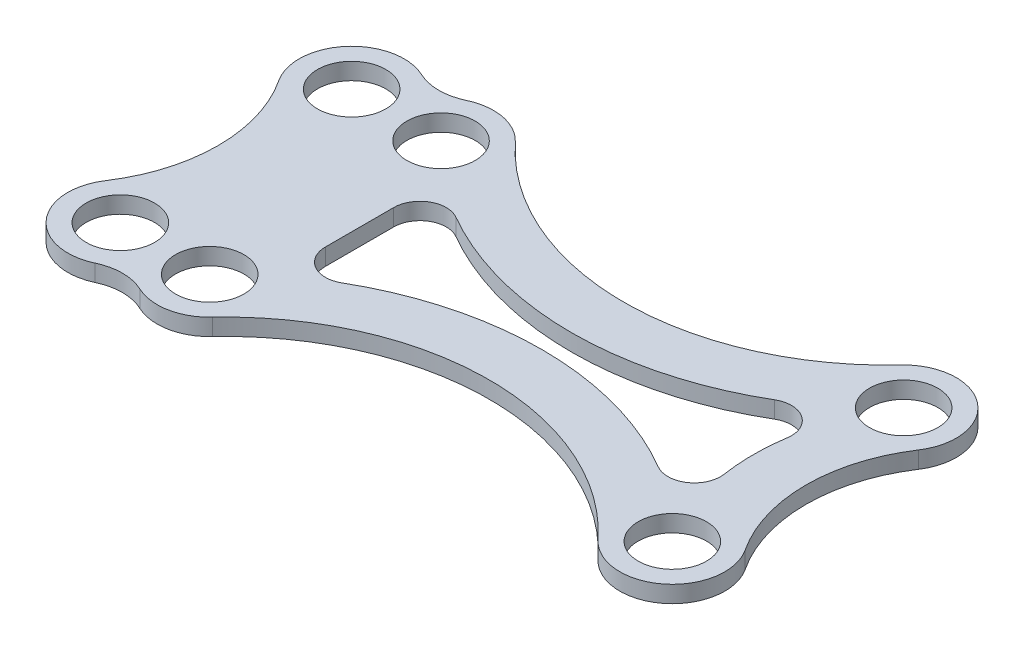
ISO-10303-21;
HEADER;
FILE_DESCRIPTION(('STEP AP214'),'2;1');
FILE_NAME('part.step','',(''),(''),'','','');
FILE_SCHEMA(('AUTOMOTIVE_DESIGN { 1 0 10303 214 1 1 1 1 }'));
ENDSEC;
DATA;
#1=APPLICATION_CONTEXT('core data for automotive mechanical design processes');
#2=APPLICATION_PROTOCOL_DEFINITION('international standard','automotive_design',2000,#1);
#3=PRODUCT_CONTEXT('',#1,'mechanical');
#4=PRODUCT('Part','Part','',(#3));
#5=PRODUCT_RELATED_PRODUCT_CATEGORY('part','',(#4));
#6=PRODUCT_DEFINITION_FORMATION('','',#4);
#7=PRODUCT_DEFINITION_CONTEXT('part definition',#1,'design');
#8=PRODUCT_DEFINITION('design','',#6,#7);
#9=PRODUCT_DEFINITION_SHAPE('','',#8);
#10=(LENGTH_UNIT() NAMED_UNIT(*) SI_UNIT(.MILLI.,.METRE.));
#11=(NAMED_UNIT(*) PLANE_ANGLE_UNIT() SI_UNIT($,.RADIAN.));
#12=(NAMED_UNIT(*) SI_UNIT($,.STERADIAN.) SOLID_ANGLE_UNIT());
#13=UNCERTAINTY_MEASURE_WITH_UNIT(LENGTH_MEASURE(1.E-05),#10,'distance_accuracy_value','');
#14=(GEOMETRIC_REPRESENTATION_CONTEXT(3) GLOBAL_UNCERTAINTY_ASSIGNED_CONTEXT((#13)) GLOBAL_UNIT_ASSIGNED_CONTEXT((#10,
#11,#12)) REPRESENTATION_CONTEXT('',''));
#15=CARTESIAN_POINT('',(0.,0.,0.));
#16=DIRECTION('',(0.,0.,1.));
#17=DIRECTION('',(1.,0.,0.));
#18=AXIS2_PLACEMENT_3D('',#15,#16,#17);
#19=CARTESIAN_POINT('',(-33.4065861769801,-3.2,0.));
#20=DIRECTION('',(0.,1.,0.));
#21=DIRECTION('',(0.,0.,1.));
#22=AXIS2_PLACEMENT_3D('',#19,#20,#21);
#23=CYLINDRICAL_SURFACE('',#22,30.);
#24=CARTESIAN_POINT('',(-33.4065861769801,0.,0.));
#25=DIRECTION('',(0.,-1.,0.));
#26=DIRECTION('',(0.,0.,-1.));
#27=AXIS2_PLACEMENT_3D('',#24,#25,#26);
#28=CIRCLE('',#27,30.);
#29=CARTESIAN_POINT('',(-8.35164654424504,0.,-16.5));
#30=VERTEX_POINT('',#29);
#31=CARTESIAN_POINT('',(-8.35164654424504,0.,16.5));
#32=VERTEX_POINT('',#31);
#33=EDGE_CURVE('E271',#30,#32,#28,.T.);
#34=ORIENTED_EDGE('',*,*,#33,.F.);
#35=DIRECTION('',(0.,1.,0.));
#36=VECTOR('',#35,1.);
#37=CARTESIAN_POINT('',(-8.35164654424504,-3.2,-16.5));
#38=LINE('',#37,#36);
#39=CARTESIAN_POINT('',(-8.35164654424504,-3.2,-16.5));
#40=VERTEX_POINT('',#39);
#41=EDGE_CURVE('E11',#40,#30,#38,.T.);
#42=ORIENTED_EDGE('',*,*,#41,.F.);
#43=CARTESIAN_POINT('',(-33.4065861769801,-3.2,0.));
#44=DIRECTION('',(0.,-1.,0.));
#45=DIRECTION('',(0.,0.,-1.));
#46=AXIS2_PLACEMENT_3D('',#43,#44,#45);
#47=CIRCLE('',#46,30.);
#48=CARTESIAN_POINT('',(-8.35164654424504,-3.2,16.5));
#49=VERTEX_POINT('',#48);
#50=EDGE_CURVE('E307',#40,#49,#47,.T.);
#51=ORIENTED_EDGE('',*,*,#50,.T.);
#52=DIRECTION('',(0.,1.,0.));
#53=VECTOR('',#52,1.);
#54=CARTESIAN_POINT('',(-8.35164654424504,-3.2,16.5));
#55=LINE('',#54,#53);
#56=EDGE_CURVE('E32',#49,#32,#55,.T.);
#57=ORIENTED_EDGE('',*,*,#56,.T.);
#58=EDGE_LOOP('',(#34,#42,#51,#57));
#59=FACE_BOUND('',#58,.T.);
#60=ADVANCED_FACE('F29',(#59),#23,.F.);
#61=CARTESIAN_POINT('',(0.,-3.2,-22.));
#62=DIRECTION('',(0.,1.,0.));
#63=DIRECTION('',(0.,0.,1.));
#64=AXIS2_PLACEMENT_3D('',#61,#62,#63);
#65=CYLINDRICAL_SURFACE('',#64,10.);
#66=CARTESIAN_POINT('',(0.,0.,-22.));
#67=DIRECTION('',(0.,1.,0.));
#68=DIRECTION('',(0.,0.,1.));
#69=AXIS2_PLACEMENT_3D('',#66,#67,#68);
#70=CIRCLE('',#69,10.);
#71=CARTESIAN_POINT('',(4.25,0.,-31.0519334951158));
#72=VERTEX_POINT('',#71);
#73=EDGE_CURVE('E304',#72,#30,#70,.T.);
#74=ORIENTED_EDGE('',*,*,#73,.F.);
#75=DIRECTION('',(0.,1.,0.));
#76=VECTOR('',#75,1.);
#77=CARTESIAN_POINT('',(4.25,-3.2,-31.0519334951158));
#78=LINE('',#77,#76);
#79=CARTESIAN_POINT('',(4.25,-3.2,-31.0519334951158));
#80=VERTEX_POINT('',#79);
#81=EDGE_CURVE('E37',#80,#72,#78,.T.);
#82=ORIENTED_EDGE('',*,*,#81,.F.);
#83=CARTESIAN_POINT('',(0.,-3.2,-22.));
#84=DIRECTION('',(0.,1.,0.));
#85=DIRECTION('',(0.,0.,1.));
#86=AXIS2_PLACEMENT_3D('',#83,#84,#85);
#87=CIRCLE('',#86,10.);
#88=EDGE_CURVE('E340',#80,#40,#87,.T.);
#89=ORIENTED_EDGE('',*,*,#88,.T.);
#90=ORIENTED_EDGE('',*,*,#41,.T.);
#91=EDGE_LOOP('',(#74,#82,#89,#90));
#92=FACE_BOUND('',#91,.T.);
#93=ADVANCED_FACE('F372',(#92),#65,.T.);
#94=CARTESIAN_POINT('',(8.5,-3.2,-40.1038669902317));
#95=DIRECTION('',(0.,1.,0.));
#96=DIRECTION('',(0.,0.,1.));
#97=AXIS2_PLACEMENT_3D('',#94,#95,#96);
#98=CYLINDRICAL_SURFACE('',#97,10.);
#99=CARTESIAN_POINT('',(8.5,0.,-40.1038669902317));
#100=DIRECTION('',(0.,-1.,0.));
#101=DIRECTION('',(0.,0.,1.));
#102=AXIS2_PLACEMENT_3D('',#99,#100,#101);
#103=CIRCLE('',#102,10.);
#104=CARTESIAN_POINT('',(12.75,0.,-31.0519334951158));
#105=VERTEX_POINT('',#104);
#106=EDGE_CURVE('E301',#105,#72,#103,.T.);
#107=ORIENTED_EDGE('',*,*,#106,.F.);
#108=DIRECTION('',(0.,1.,0.));
#109=VECTOR('',#108,1.);
#110=CARTESIAN_POINT('',(12.75,-3.2,-31.0519334951158));
#111=LINE('',#110,#109);
#112=CARTESIAN_POINT('',(12.75,-3.2,-31.0519334951158));
#113=VERTEX_POINT('',#112);
#114=EDGE_CURVE('E344',#113,#105,#111,.T.);
#115=ORIENTED_EDGE('',*,*,#114,.F.);
#116=CARTESIAN_POINT('',(8.5,-3.2,-40.1038669902317));
#117=DIRECTION('',(0.,-1.,0.));
#118=DIRECTION('',(0.,0.,1.));
#119=AXIS2_PLACEMENT_3D('',#116,#117,#118);
#120=CIRCLE('',#119,10.);
#121=EDGE_CURVE('E337',#113,#80,#120,.T.);
#122=ORIENTED_EDGE('',*,*,#121,.T.);
#123=ORIENTED_EDGE('',*,*,#81,.T.);
#124=EDGE_LOOP('',(#107,#115,#122,#123));
#125=FACE_BOUND('',#124,.T.);
#126=ADVANCED_FACE('F409',(#125),#98,.F.);
#127=CARTESIAN_POINT('',(17.,-3.2,-22.));
#128=DIRECTION('',(0.,1.,0.));
#129=DIRECTION('',(0.,0.,1.));
#130=AXIS2_PLACEMENT_3D('',#127,#128,#129);
#131=CYLINDRICAL_SURFACE('',#130,9.99999999999999);
#132=CARTESIAN_POINT('',(17.,0.,-22.));
#133=DIRECTION('',(0.,1.,0.));
#134=DIRECTION('',(0.,0.,1.));
#135=AXIS2_PLACEMENT_3D('',#132,#133,#134);
#136=CIRCLE('',#135,9.99999999999999);
#137=CARTESIAN_POINT('',(24.3333333333333,0.,-28.7986926847904));
#138=VERTEX_POINT('',#137);
#139=EDGE_CURVE('E298',#138,#105,#136,.T.);
#140=ORIENTED_EDGE('',*,*,#139,.F.);
#141=DIRECTION('',(0.,1.,0.));
#142=VECTOR('',#141,1.);
#143=CARTESIAN_POINT('',(24.3333333333333,-3.2,-28.7986926847904));
#144=LINE('',#143,#142);
#145=CARTESIAN_POINT('',(24.3333333333333,-3.2,-28.7986926847904));
#146=VERTEX_POINT('',#145);
#147=EDGE_CURVE('E346',#146,#138,#144,.T.);
#148=ORIENTED_EDGE('',*,*,#147,.F.);
#149=CARTESIAN_POINT('',(17.,-3.2,-22.));
#150=DIRECTION('',(0.,1.,0.));
#151=DIRECTION('',(0.,0.,1.));
#152=AXIS2_PLACEMENT_3D('',#149,#150,#151);
#153=CIRCLE('',#152,9.99999999999999);
#154=EDGE_CURVE('E334',#146,#113,#153,.T.);
#155=ORIENTED_EDGE('',*,*,#154,.T.);
#156=ORIENTED_EDGE('',*,*,#114,.T.);
#157=EDGE_LOOP('',(#140,#148,#155,#156));
#158=FACE_BOUND('',#157,.T.);
#159=ADVANCED_FACE('F406',(#158),#131,.T.);
#160=CARTESIAN_POINT('',(61.,-3.2,-62.7921561087423));
#161=DIRECTION('',(0.,1.,0.));
#162=DIRECTION('',(0.,0.,1.));
#163=AXIS2_PLACEMENT_3D('',#160,#161,#162);
#164=CYLINDRICAL_SURFACE('',#163,50.);
#165=CARTESIAN_POINT('',(61.,0.,-62.7921561087423));
#166=DIRECTION('',(0.,-1.,0.));
#167=DIRECTION('',(0.,0.,1.));
#168=AXIS2_PLACEMENT_3D('',#165,#166,#167);
#169=CIRCLE('',#168,50.);
#170=CARTESIAN_POINT('',(97.6666666666667,0.,-28.7986926847904));
#171=VERTEX_POINT('',#170);
#172=EDGE_CURVE('E295',#171,#138,#169,.T.);
#173=ORIENTED_EDGE('',*,*,#172,.F.);
#174=DIRECTION('',(0.,1.,0.));
#175=VECTOR('',#174,1.);
#176=CARTESIAN_POINT('',(97.6666666666667,-3.2,-28.7986926847904));
#177=LINE('',#176,#175);
#178=CARTESIAN_POINT('',(97.6666666666667,-3.2,-28.7986926847904));
#179=VERTEX_POINT('',#178);
#180=EDGE_CURVE('E348',#179,#171,#177,.T.);
#181=ORIENTED_EDGE('',*,*,#180,.F.);
#182=CARTESIAN_POINT('',(61.,-3.2,-62.7921561087423));
#183=DIRECTION('',(0.,-1.,0.));
#184=DIRECTION('',(0.,0.,1.));
#185=AXIS2_PLACEMENT_3D('',#182,#183,#184);
#186=CIRCLE('',#185,50.);
#187=EDGE_CURVE('E331',#179,#146,#186,.T.);
#188=ORIENTED_EDGE('',*,*,#187,.T.);
#189=ORIENTED_EDGE('',*,*,#147,.T.);
#190=EDGE_LOOP('',(#173,#181,#188,#189));
#191=FACE_BOUND('',#190,.T.);
#192=ADVANCED_FACE('F403',(#191),#164,.F.);
#193=CARTESIAN_POINT('',(105.,-3.2,-22.));
#194=DIRECTION('',(0.,1.,0.));
#195=DIRECTION('',(0.,0.,1.));
#196=AXIS2_PLACEMENT_3D('',#193,#194,#195);
#197=CYLINDRICAL_SURFACE('',#196,10.);
#198=CARTESIAN_POINT('',(105.,0.,-22.));
#199=DIRECTION('',(0.,1.,0.));
#200=DIRECTION('',(0.,0.,1.));
#201=AXIS2_PLACEMENT_3D('',#198,#199,#200);
#202=CIRCLE('',#201,10.);
#203=CARTESIAN_POINT('',(113.351646544245,0.,-16.5));
#204=VERTEX_POINT('',#203);
#205=EDGE_CURVE('E292',#204,#171,#202,.T.);
#206=ORIENTED_EDGE('',*,*,#205,.F.);
#207=DIRECTION('',(0.,1.,0.));
#208=VECTOR('',#207,1.);
#209=CARTESIAN_POINT('',(113.351646544245,-3.2,-16.5));
#210=LINE('',#209,#208);
#211=CARTESIAN_POINT('',(113.351646544245,-3.2,-16.5));
#212=VERTEX_POINT('',#211);
#213=EDGE_CURVE('E350',#212,#204,#210,.T.);
#214=ORIENTED_EDGE('',*,*,#213,.F.);
#215=CARTESIAN_POINT('',(105.,-3.2,-22.));
#216=DIRECTION('',(0.,1.,0.));
#217=DIRECTION('',(0.,0.,1.));
#218=AXIS2_PLACEMENT_3D('',#215,#216,#217);
#219=CIRCLE('',#218,10.);
#220=EDGE_CURVE('E328',#212,#179,#219,.T.);
#221=ORIENTED_EDGE('',*,*,#220,.T.);
#222=ORIENTED_EDGE('',*,*,#180,.T.);
#223=EDGE_LOOP('',(#206,#214,#221,#222));
#224=FACE_BOUND('',#223,.T.);
#225=ADVANCED_FACE('F399',(#224),#197,.T.);
#226=CARTESIAN_POINT('',(138.40658617698,-3.2,0.));
#227=DIRECTION('',(0.,1.,0.));
#228=DIRECTION('',(0.,0.,1.));
#229=AXIS2_PLACEMENT_3D('',#226,#227,#228);
#230=CYLINDRICAL_SURFACE('',#229,30.);
#231=CARTESIAN_POINT('',(138.40658617698,0.,0.));
#232=DIRECTION('',(0.,-1.,0.));
#233=DIRECTION('',(0.,0.,1.));
#234=AXIS2_PLACEMENT_3D('',#231,#232,#233);
#235=CIRCLE('',#234,30.);
#236=CARTESIAN_POINT('',(113.351646544245,0.,16.5));
#237=VERTEX_POINT('',#236);
#238=EDGE_CURVE('E289',#237,#204,#235,.T.);
#239=ORIENTED_EDGE('',*,*,#238,.F.);
#240=DIRECTION('',(0.,1.,0.));
#241=VECTOR('',#240,1.);
#242=CARTESIAN_POINT('',(113.351646544245,-3.2,16.5));
#243=LINE('',#242,#241);
#244=CARTESIAN_POINT('',(113.351646544245,-3.2,16.5));
#245=VERTEX_POINT('',#244);
#246=EDGE_CURVE('E352',#245,#237,#243,.T.);
#247=ORIENTED_EDGE('',*,*,#246,.F.);
#248=CARTESIAN_POINT('',(138.40658617698,-3.2,0.));
#249=DIRECTION('',(0.,-1.,0.));
#250=DIRECTION('',(0.,0.,1.));
#251=AXIS2_PLACEMENT_3D('',#248,#249,#250);
#252=CIRCLE('',#251,30.);
#253=EDGE_CURVE('E325',#245,#212,#252,.T.);
#254=ORIENTED_EDGE('',*,*,#253,.T.);
#255=ORIENTED_EDGE('',*,*,#213,.T.);
#256=EDGE_LOOP('',(#239,#247,#254,#255));
#257=FACE_BOUND('',#256,.T.);
#258=ADVANCED_FACE('F395',(#257),#230,.F.);
#259=CARTESIAN_POINT('',(105.,-3.2,22.));
#260=DIRECTION('',(0.,1.,0.));
#261=DIRECTION('',(0.,0.,1.));
#262=AXIS2_PLACEMENT_3D('',#259,#260,#261);
#263=CYLINDRICAL_SURFACE('',#262,10.);
#264=CARTESIAN_POINT('',(105.,0.,22.));
#265=DIRECTION('',(0.,1.,0.));
#266=DIRECTION('',(0.,0.,-1.));
#267=AXIS2_PLACEMENT_3D('',#264,#265,#266);
#268=CIRCLE('',#267,10.);
#269=CARTESIAN_POINT('',(97.6666666666667,0.,28.7986926847904));
#270=VERTEX_POINT('',#269);
#271=EDGE_CURVE('E286',#270,#237,#268,.T.);
#272=ORIENTED_EDGE('',*,*,#271,.F.);
#273=DIRECTION('',(0.,1.,0.));
#274=VECTOR('',#273,1.);
#275=CARTESIAN_POINT('',(97.6666666666667,-3.2,28.7986926847904));
#276=LINE('',#275,#274);
#277=CARTESIAN_POINT('',(97.6666666666667,-3.2,28.7986926847904));
#278=VERTEX_POINT('',#277);
#279=EDGE_CURVE('E354',#278,#270,#276,.T.);
#280=ORIENTED_EDGE('',*,*,#279,.F.);
#281=CARTESIAN_POINT('',(105.,-3.2,22.));
#282=DIRECTION('',(0.,1.,0.));
#283=DIRECTION('',(0.,0.,-1.));
#284=AXIS2_PLACEMENT_3D('',#281,#282,#283);
#285=CIRCLE('',#284,10.);
#286=EDGE_CURVE('E322',#278,#245,#285,.T.);
#287=ORIENTED_EDGE('',*,*,#286,.T.);
#288=ORIENTED_EDGE('',*,*,#246,.T.);
#289=EDGE_LOOP('',(#272,#280,#287,#288));
#290=FACE_BOUND('',#289,.T.);
#291=ADVANCED_FACE('F391',(#290),#263,.T.);
#292=CARTESIAN_POINT('',(61.,-3.2,62.7921561087423));
#293=DIRECTION('',(0.,1.,0.));
#294=DIRECTION('',(0.,0.,1.));
#295=AXIS2_PLACEMENT_3D('',#292,#293,#294);
#296=CYLINDRICAL_SURFACE('',#295,50.);
#297=CARTESIAN_POINT('',(61.,0.,62.7921561087423));
#298=DIRECTION('',(0.,-1.,0.));
#299=DIRECTION('',(0.,0.,-1.));
#300=AXIS2_PLACEMENT_3D('',#297,#298,#299);
#301=CIRCLE('',#300,50.);
#302=CARTESIAN_POINT('',(24.3333333333333,0.,28.7986926847903));
#303=VERTEX_POINT('',#302);
#304=EDGE_CURVE('E283',#303,#270,#301,.T.);
#305=ORIENTED_EDGE('',*,*,#304,.F.);
#306=DIRECTION('',(0.,1.,0.));
#307=VECTOR('',#306,1.);
#308=CARTESIAN_POINT('',(24.3333333333333,-3.2,28.7986926847903));
#309=LINE('',#308,#307);
#310=CARTESIAN_POINT('',(24.3333333333333,-3.2,28.7986926847903));
#311=VERTEX_POINT('',#310);
#312=EDGE_CURVE('E356',#311,#303,#309,.T.);
#313=ORIENTED_EDGE('',*,*,#312,.F.);
#314=CARTESIAN_POINT('',(61.,-3.2,62.7921561087423));
#315=DIRECTION('',(0.,-1.,0.));
#316=DIRECTION('',(0.,0.,-1.));
#317=AXIS2_PLACEMENT_3D('',#314,#315,#316);
#318=CIRCLE('',#317,50.);
#319=EDGE_CURVE('E319',#311,#278,#318,.T.);
#320=ORIENTED_EDGE('',*,*,#319,.T.);
#321=ORIENTED_EDGE('',*,*,#279,.T.);
#322=EDGE_LOOP('',(#305,#313,#320,#321));
#323=FACE_BOUND('',#322,.T.);
#324=ADVANCED_FACE('F387',(#323),#296,.F.);
#325=CARTESIAN_POINT('',(17.,-3.2,22.));
#326=DIRECTION('',(0.,1.,0.));
#327=DIRECTION('',(0.,0.,1.));
#328=AXIS2_PLACEMENT_3D('',#325,#326,#327);
#329=CYLINDRICAL_SURFACE('',#328,9.99999999999999);
#330=CARTESIAN_POINT('',(17.,0.,22.));
#331=DIRECTION('',(0.,1.,0.));
#332=DIRECTION('',(0.,0.,-1.));
#333=AXIS2_PLACEMENT_3D('',#330,#331,#332);
#334=CIRCLE('',#333,9.99999999999999);
#335=CARTESIAN_POINT('',(12.75,0.,31.0519334951158));
#336=VERTEX_POINT('',#335);
#337=EDGE_CURVE('E280',#336,#303,#334,.T.);
#338=ORIENTED_EDGE('',*,*,#337,.F.);
#339=DIRECTION('',(0.,1.,0.));
#340=VECTOR('',#339,1.);
#341=CARTESIAN_POINT('',(12.75,-3.2,31.0519334951158));
#342=LINE('',#341,#340);
#343=CARTESIAN_POINT('',(12.75,-3.2,31.0519334951158));
#344=VERTEX_POINT('',#343);
#345=EDGE_CURVE('E358',#344,#336,#342,.T.);
#346=ORIENTED_EDGE('',*,*,#345,.F.);
#347=CARTESIAN_POINT('',(17.,-3.2,22.));
#348=DIRECTION('',(0.,1.,0.));
#349=DIRECTION('',(0.,0.,-1.));
#350=AXIS2_PLACEMENT_3D('',#347,#348,#349);
#351=CIRCLE('',#350,9.99999999999999);
#352=EDGE_CURVE('E316',#344,#311,#351,.T.);
#353=ORIENTED_EDGE('',*,*,#352,.T.);
#354=ORIENTED_EDGE('',*,*,#312,.T.);
#355=EDGE_LOOP('',(#338,#346,#353,#354));
#356=FACE_BOUND('',#355,.T.);
#357=ADVANCED_FACE('F385',(#356),#329,.T.);
#358=CARTESIAN_POINT('',(8.5,-3.2,40.1038669902317));
#359=DIRECTION('',(0.,1.,0.));
#360=DIRECTION('',(0.,0.,1.));
#361=AXIS2_PLACEMENT_3D('',#358,#359,#360);
#362=CYLINDRICAL_SURFACE('',#361,10.);
#363=CARTESIAN_POINT('',(8.5,0.,40.1038669902317));
#364=DIRECTION('',(0.,-1.,0.));
#365=DIRECTION('',(0.,0.,-1.));
#366=AXIS2_PLACEMENT_3D('',#363,#364,#365);
#367=CIRCLE('',#366,10.);
#368=CARTESIAN_POINT('',(4.24999999999999,0.,31.0519334951158));
#369=VERTEX_POINT('',#368);
#370=EDGE_CURVE('E277',#369,#336,#367,.T.);
#371=ORIENTED_EDGE('',*,*,#370,.F.);
#372=DIRECTION('',(0.,1.,0.));
#373=VECTOR('',#372,1.);
#374=CARTESIAN_POINT('',(4.24999999999999,-3.2,31.0519334951158));
#375=LINE('',#374,#373);
#376=CARTESIAN_POINT('',(4.24999999999999,-3.2,31.0519334951158));
#377=VERTEX_POINT('',#376);
#378=EDGE_CURVE('E359',#377,#369,#375,.T.);
#379=ORIENTED_EDGE('',*,*,#378,.F.);
#380=CARTESIAN_POINT('',(8.5,-3.2,40.1038669902317));
#381=DIRECTION('',(0.,-1.,0.));
#382=DIRECTION('',(0.,0.,-1.));
#383=AXIS2_PLACEMENT_3D('',#380,#381,#382);
#384=CIRCLE('',#383,10.);
#385=EDGE_CURVE('E313',#377,#344,#384,.T.);
#386=ORIENTED_EDGE('',*,*,#385,.T.);
#387=ORIENTED_EDGE('',*,*,#345,.T.);
#388=EDGE_LOOP('',(#371,#379,#386,#387));
#389=FACE_BOUND('',#388,.T.);
#390=ADVANCED_FACE('F381',(#389),#362,.F.);
#391=CARTESIAN_POINT('',(0.,-3.2,22.));
#392=DIRECTION('',(0.,1.,0.));
#393=DIRECTION('',(0.,0.,1.));
#394=AXIS2_PLACEMENT_3D('',#391,#392,#393);
#395=CYLINDRICAL_SURFACE('',#394,10.);
#396=CARTESIAN_POINT('',(0.,0.,22.));
#397=DIRECTION('',(0.,1.,0.));
#398=DIRECTION('',(0.,0.,-1.));
#399=AXIS2_PLACEMENT_3D('',#396,#397,#398);
#400=CIRCLE('',#399,10.);
#401=EDGE_CURVE('E274',#32,#369,#400,.T.);
#402=ORIENTED_EDGE('',*,*,#401,.F.);
#403=ORIENTED_EDGE('',*,*,#56,.F.);
#404=CARTESIAN_POINT('',(0.,-3.2,22.));
#405=DIRECTION('',(0.,1.,0.));
#406=DIRECTION('',(0.,0.,-1.));
#407=AXIS2_PLACEMENT_3D('',#404,#405,#406);
#408=CIRCLE('',#407,10.);
#409=EDGE_CURVE('E310',#49,#377,#408,.T.);
#410=ORIENTED_EDGE('',*,*,#409,.T.);
#411=ORIENTED_EDGE('',*,*,#378,.T.);
#412=EDGE_LOOP('',(#402,#403,#410,#411));
#413=FACE_BOUND('',#412,.T.);
#414=ADVANCED_FACE('F367',(#413),#395,.T.);
#415=CARTESIAN_POINT('',(-16.7032930884901,-3.2,11.));
#416=DIRECTION('',(0.,-1.,0.));
#417=DIRECTION('',(0.,0.,-1.));
#418=AXIS2_PLACEMENT_3D('',#415,#416,#417);
#419=PLANE('',#418);
#420=CARTESIAN_POINT('',(61.,-3.2,62.7921561087423));
#421=DIRECTION('',(0.,-1.,0.));
#422=DIRECTION('',(0.,0.,1.));
#423=AXIS2_PLACEMENT_3D('',#420,#421,#422);
#424=CIRCLE('',#423,60.);
#425=CARTESIAN_POINT('',(31.,-3.2,10.8306318816759));
#426=VERTEX_POINT('',#425);
#427=CARTESIAN_POINT('',(91.3825972699008,-3.2,11.053410635596));
#428=VERTEX_POINT('',#427);
#429=EDGE_CURVE('E202',#426,#428,#424,.T.);
#430=ORIENTED_EDGE('',*,*,#429,.T.);
#431=CARTESIAN_POINT('',(93.9144803757259,-3.2,6.74184851283382));
#432=DIRECTION('',(0.,1.,0.));
#433=DIRECTION('',(0.,0.,1.));
#434=AXIS2_PLACEMENT_3D('',#431,#432,#433);
#435=CIRCLE('',#434,5.);
#436=CARTESIAN_POINT('',(98.8580476869764,-3.2,5.99275423363006));
#437=VERTEX_POINT('',#436);
#438=EDGE_CURVE('E205',#428,#437,#435,.T.);
#439=ORIENTED_EDGE('',*,*,#438,.T.);
#440=CARTESIAN_POINT('',(138.40658617698,-3.2,0.));
#441=DIRECTION('',(0.,-1.,0.));
#442=DIRECTION('',(0.,0.,1.));
#443=AXIS2_PLACEMENT_3D('',#440,#441,#442);
#444=CIRCLE('',#443,40.);
#445=CARTESIAN_POINT('',(98.8580476869764,-3.2,-5.99275423363008));
#446=VERTEX_POINT('',#445);
#447=EDGE_CURVE('E45',#437,#446,#444,.T.);
#448=ORIENTED_EDGE('',*,*,#447,.T.);
#449=CARTESIAN_POINT('',(93.9144803757259,-3.2,-6.74184851283382));
#450=DIRECTION('',(0.,1.,0.));
#451=DIRECTION('',(0.,0.,-1.));
#452=AXIS2_PLACEMENT_3D('',#449,#450,#451);
#453=CIRCLE('',#452,5.);
#454=CARTESIAN_POINT('',(91.3825972699008,-3.2,-11.053410635596));
#455=VERTEX_POINT('',#454);
#456=EDGE_CURVE('E208',#446,#455,#453,.T.);
#457=ORIENTED_EDGE('',*,*,#456,.T.);
#458=CARTESIAN_POINT('',(61.,-3.2,-62.7921561087423));
#459=DIRECTION('',(0.,-1.,0.));
#460=DIRECTION('',(0.,0.,1.));
#461=AXIS2_PLACEMENT_3D('',#458,#459,#460);
#462=CIRCLE('',#461,60.);
#463=CARTESIAN_POINT('',(31.,-3.2,-10.830631881676));
#464=VERTEX_POINT('',#463);
#465=EDGE_CURVE('E211',#455,#464,#462,.T.);
#466=ORIENTED_EDGE('',*,*,#465,.T.);
#467=CARTESIAN_POINT('',(28.5,-3.2,-6.50050486275375));
#468=DIRECTION('',(0.,1.,0.));
#469=DIRECTION('',(0.,0.,1.));
#470=AXIS2_PLACEMENT_3D('',#467,#468,#469);
#471=CIRCLE('',#470,5.);
#472=CARTESIAN_POINT('',(23.5,-3.2,-6.50050486275376));
#473=VERTEX_POINT('',#472);
#474=EDGE_CURVE('E214',#464,#473,#471,.T.);
#475=ORIENTED_EDGE('',*,*,#474,.T.);
#476=DIRECTION('',(0.,0.,1.));
#477=VECTOR('',#476,1.);
#478=CARTESIAN_POINT('',(23.5,-3.2,-6.50050486275375));
#479=LINE('',#478,#477);
#480=CARTESIAN_POINT('',(23.5,-3.2,6.50050486275375));
#481=VERTEX_POINT('',#480);
#482=EDGE_CURVE('E217',#473,#481,#479,.T.);
#483=ORIENTED_EDGE('',*,*,#482,.T.);
#484=CARTESIAN_POINT('',(28.5,-3.2,6.50050486275375));
#485=DIRECTION('',(0.,1.,0.));
#486=DIRECTION('',(0.,0.,1.));
#487=AXIS2_PLACEMENT_3D('',#484,#485,#486);
#488=CIRCLE('',#487,4.99999999999999);
#489=EDGE_CURVE('E220',#481,#426,#488,.T.);
#490=ORIENTED_EDGE('',*,*,#489,.T.);
#491=EDGE_LOOP('',(#430,#439,#448,#457,#466,#475,#483,#490));
#492=FACE_BOUND('',#491,.T.);
#493=CARTESIAN_POINT('',(0.,-3.2,22.));
#494=DIRECTION('',(0.,1.,0.));
#495=DIRECTION('',(0.,0.,1.));
#496=AXIS2_PLACEMENT_3D('',#493,#494,#495);
#497=CIRCLE('',#496,6.5);
#498=CARTESIAN_POINT('',(0.,-3.2,28.5));
#499=VERTEX_POINT('',#498);
#500=EDGE_CURVE('E238',#499,#499,#497,.T.);
#501=ORIENTED_EDGE('',*,*,#500,.T.);
#502=EDGE_LOOP('',(#501));
#503=FACE_BOUND('',#502,.T.);
#504=CARTESIAN_POINT('',(17.,-3.2,22.));
#505=DIRECTION('',(0.,1.,0.));
#506=DIRECTION('',(0.,0.,1.));
#507=AXIS2_PLACEMENT_3D('',#504,#505,#506);
#508=CIRCLE('',#507,6.5);
#509=CARTESIAN_POINT('',(17.,-3.2,28.5));
#510=VERTEX_POINT('',#509);
#511=EDGE_CURVE('E244',#510,#510,#508,.T.);
#512=ORIENTED_EDGE('',*,*,#511,.T.);
#513=EDGE_LOOP('',(#512));
#514=FACE_BOUND('',#513,.T.);
#515=CARTESIAN_POINT('',(105.,-3.2,22.));
#516=DIRECTION('',(0.,1.,0.));
#517=DIRECTION('',(0.,0.,1.));
#518=AXIS2_PLACEMENT_3D('',#515,#516,#517);
#519=CIRCLE('',#518,6.5);
#520=CARTESIAN_POINT('',(105.,-3.2,28.5));
#521=VERTEX_POINT('',#520);
#522=EDGE_CURVE('E250',#521,#521,#519,.T.);
#523=ORIENTED_EDGE('',*,*,#522,.T.);
#524=EDGE_LOOP('',(#523));
#525=FACE_BOUND('',#524,.T.);
#526=CARTESIAN_POINT('',(105.,-3.2,-22.));
#527=DIRECTION('',(0.,1.,0.));
#528=DIRECTION('',(0.,0.,1.));
#529=AXIS2_PLACEMENT_3D('',#526,#527,#528);
#530=CIRCLE('',#529,6.5);
#531=CARTESIAN_POINT('',(105.,-3.2,-15.5));
#532=VERTEX_POINT('',#531);
#533=EDGE_CURVE('E256',#532,#532,#530,.T.);
#534=ORIENTED_EDGE('',*,*,#533,.T.);
#535=EDGE_LOOP('',(#534));
#536=FACE_BOUND('',#535,.T.);
#537=CARTESIAN_POINT('',(17.,-3.2,-22.));
#538=DIRECTION('',(0.,1.,0.));
#539=DIRECTION('',(0.,0.,1.));
#540=AXIS2_PLACEMENT_3D('',#537,#538,#539);
#541=CIRCLE('',#540,6.5);
#542=CARTESIAN_POINT('',(17.,-3.2,-15.5));
#543=VERTEX_POINT('',#542);
#544=EDGE_CURVE('E262',#543,#543,#541,.T.);
#545=ORIENTED_EDGE('',*,*,#544,.T.);
#546=EDGE_LOOP('',(#545));
#547=FACE_BOUND('',#546,.T.);
#548=CARTESIAN_POINT('',(0.,-3.2,-22.));
#549=DIRECTION('',(0.,1.,0.));
#550=DIRECTION('',(0.,0.,1.));
#551=AXIS2_PLACEMENT_3D('',#548,#549,#550);
#552=CIRCLE('',#551,6.5);
#553=CARTESIAN_POINT('',(0.,-3.2,-15.5));
#554=VERTEX_POINT('',#553);
#555=EDGE_CURVE('E268',#554,#554,#552,.T.);
#556=ORIENTED_EDGE('',*,*,#555,.T.);
#557=EDGE_LOOP('',(#556));
#558=FACE_BOUND('',#557,.T.);
#559=ORIENTED_EDGE('',*,*,#50,.F.);
#560=ORIENTED_EDGE('',*,*,#88,.F.);
#561=ORIENTED_EDGE('',*,*,#121,.F.);
#562=ORIENTED_EDGE('',*,*,#154,.F.);
#563=ORIENTED_EDGE('',*,*,#187,.F.);
#564=ORIENTED_EDGE('',*,*,#220,.F.);
#565=ORIENTED_EDGE('',*,*,#253,.F.);
#566=ORIENTED_EDGE('',*,*,#286,.F.);
#567=ORIENTED_EDGE('',*,*,#319,.F.);
#568=ORIENTED_EDGE('',*,*,#352,.F.);
#569=ORIENTED_EDGE('',*,*,#385,.F.);
#570=ORIENTED_EDGE('',*,*,#409,.F.);
#571=EDGE_LOOP('',(#559,#560,#561,#562,#563,#564,#565,#566,#567,#568,#569,#570));
#572=FACE_BOUND('',#571,.T.);
#573=ADVANCED_FACE('F375',(#492,#503,#514,#525,#536,#547,#558,#572),#419,.T.);
#574=CARTESIAN_POINT('',(-16.7032930884901,0.,11.));
#575=DIRECTION('',(0.,-1.,0.));
#576=DIRECTION('',(0.,0.,-1.));
#577=AXIS2_PLACEMENT_3D('',#574,#575,#576);
#578=PLANE('',#577);
#579=CARTESIAN_POINT('',(93.9144803757259,0.,6.74184851283382));
#580=DIRECTION('',(0.,1.,0.));
#581=DIRECTION('',(0.,0.,1.));
#582=AXIS2_PLACEMENT_3D('',#579,#580,#581);
#583=CIRCLE('',#582,5.);
#584=CARTESIAN_POINT('',(91.3825972699008,0.,11.053410635596));
#585=VERTEX_POINT('',#584);
#586=CARTESIAN_POINT('',(98.8580476869764,0.,5.99275423363006));
#587=VERTEX_POINT('',#586);
#588=EDGE_CURVE('E177',#585,#587,#583,.T.);
#589=ORIENTED_EDGE('',*,*,#588,.F.);
#590=CARTESIAN_POINT('',(61.,0.,62.7921561087423));
#591=DIRECTION('',(0.,-1.,0.));
#592=DIRECTION('',(0.,0.,1.));
#593=AXIS2_PLACEMENT_3D('',#590,#591,#592);
#594=CIRCLE('',#593,60.);
#595=CARTESIAN_POINT('',(31.,0.,10.8306318816759));
#596=VERTEX_POINT('',#595);
#597=EDGE_CURVE('E53',#596,#585,#594,.T.);
#598=ORIENTED_EDGE('',*,*,#597,.F.);
#599=CARTESIAN_POINT('',(28.5,0.,6.50050486275375));
#600=DIRECTION('',(0.,1.,0.));
#601=DIRECTION('',(0.,0.,1.));
#602=AXIS2_PLACEMENT_3D('',#599,#600,#601);
#603=CIRCLE('',#602,4.99999999999999);
#604=CARTESIAN_POINT('',(23.5,0.,6.50050486275375));
#605=VERTEX_POINT('',#604);
#606=EDGE_CURVE('E199',#605,#596,#603,.T.);
#607=ORIENTED_EDGE('',*,*,#606,.F.);
#608=DIRECTION('',(0.,0.,1.));
#609=VECTOR('',#608,1.);
#610=CARTESIAN_POINT('',(23.5,0.,-6.50050486275375));
#611=LINE('',#610,#609);
#612=CARTESIAN_POINT('',(23.5,0.,-6.50050486275376));
#613=VERTEX_POINT('',#612);
#614=EDGE_CURVE('E196',#613,#605,#611,.T.);
#615=ORIENTED_EDGE('',*,*,#614,.F.);
#616=CARTESIAN_POINT('',(28.5,0.,-6.50050486275375));
#617=DIRECTION('',(0.,1.,0.));
#618=DIRECTION('',(0.,0.,1.));
#619=AXIS2_PLACEMENT_3D('',#616,#617,#618);
#620=CIRCLE('',#619,5.);
#621=CARTESIAN_POINT('',(31.,0.,-10.830631881676));
#622=VERTEX_POINT('',#621);
#623=EDGE_CURVE('E193',#622,#613,#620,.T.);
#624=ORIENTED_EDGE('',*,*,#623,.F.);
#625=CARTESIAN_POINT('',(61.,0.,-62.7921561087423));
#626=DIRECTION('',(0.,-1.,0.));
#627=DIRECTION('',(0.,0.,1.));
#628=AXIS2_PLACEMENT_3D('',#625,#626,#627);
#629=CIRCLE('',#628,60.);
#630=CARTESIAN_POINT('',(91.3825972699008,0.,-11.053410635596));
#631=VERTEX_POINT('',#630);
#632=EDGE_CURVE('E187',#631,#622,#629,.T.);
#633=ORIENTED_EDGE('',*,*,#632,.F.);
#634=CARTESIAN_POINT('',(93.9144803757259,0.,-6.74184851283382));
#635=DIRECTION('',(0.,1.,0.));
#636=DIRECTION('',(0.,0.,-1.));
#637=AXIS2_PLACEMENT_3D('',#634,#635,#636);
#638=CIRCLE('',#637,5.);
#639=CARTESIAN_POINT('',(98.8580476869764,0.,-5.99275423363008));
#640=VERTEX_POINT('',#639);
#641=EDGE_CURVE('E185',#640,#631,#638,.T.);
#642=ORIENTED_EDGE('',*,*,#641,.F.);
#643=CARTESIAN_POINT('',(138.40658617698,0.,0.));
#644=DIRECTION('',(0.,-1.,0.));
#645=DIRECTION('',(0.,0.,1.));
#646=AXIS2_PLACEMENT_3D('',#643,#644,#645);
#647=CIRCLE('',#646,40.);
#648=EDGE_CURVE('E168',#587,#640,#647,.T.);
#649=ORIENTED_EDGE('',*,*,#648,.F.);
#650=EDGE_LOOP('',(#589,#598,#607,#615,#624,#633,#642,#649));
#651=FACE_BOUND('',#650,.T.);
#652=CARTESIAN_POINT('',(0.,0.,22.));
#653=DIRECTION('',(0.,1.,0.));
#654=DIRECTION('',(0.,0.,1.));
#655=AXIS2_PLACEMENT_3D('',#652,#653,#654);
#656=CIRCLE('',#655,6.5);
#657=CARTESIAN_POINT('',(0.,0.,28.5));
#658=VERTEX_POINT('',#657);
#659=EDGE_CURVE('E225',#658,#658,#656,.T.);
#660=ORIENTED_EDGE('',*,*,#659,.F.);
#661=EDGE_LOOP('',(#660));
#662=FACE_BOUND('',#661,.T.);
#663=CARTESIAN_POINT('',(17.,0.,22.));
#664=DIRECTION('',(0.,1.,0.));
#665=DIRECTION('',(0.,0.,1.));
#666=AXIS2_PLACEMENT_3D('',#663,#664,#665);
#667=CIRCLE('',#666,6.5);
#668=CARTESIAN_POINT('',(17.,0.,28.5));
#669=VERTEX_POINT('',#668);
#670=EDGE_CURVE('E241',#669,#669,#667,.T.);
#671=ORIENTED_EDGE('',*,*,#670,.F.);
#672=EDGE_LOOP('',(#671));
#673=FACE_BOUND('',#672,.T.);
#674=CARTESIAN_POINT('',(105.,0.,22.));
#675=DIRECTION('',(0.,1.,0.));
#676=DIRECTION('',(0.,0.,1.));
#677=AXIS2_PLACEMENT_3D('',#674,#675,#676);
#678=CIRCLE('',#677,6.5);
#679=CARTESIAN_POINT('',(105.,0.,28.5));
#680=VERTEX_POINT('',#679);
#681=EDGE_CURVE('E247',#680,#680,#678,.T.);
#682=ORIENTED_EDGE('',*,*,#681,.F.);
#683=EDGE_LOOP('',(#682));
#684=FACE_BOUND('',#683,.T.);
#685=CARTESIAN_POINT('',(105.,0.,-22.));
#686=DIRECTION('',(0.,1.,0.));
#687=DIRECTION('',(0.,0.,1.));
#688=AXIS2_PLACEMENT_3D('',#685,#686,#687);
#689=CIRCLE('',#688,6.5);
#690=CARTESIAN_POINT('',(105.,0.,-15.5));
#691=VERTEX_POINT('',#690);
#692=EDGE_CURVE('E253',#691,#691,#689,.T.);
#693=ORIENTED_EDGE('',*,*,#692,.F.);
#694=EDGE_LOOP('',(#693));
#695=FACE_BOUND('',#694,.T.);
#696=CARTESIAN_POINT('',(17.,0.,-22.));
#697=DIRECTION('',(0.,1.,0.));
#698=DIRECTION('',(0.,0.,1.));
#699=AXIS2_PLACEMENT_3D('',#696,#697,#698);
#700=CIRCLE('',#699,6.5);
#701=CARTESIAN_POINT('',(17.,0.,-15.5));
#702=VERTEX_POINT('',#701);
#703=EDGE_CURVE('E259',#702,#702,#700,.T.);
#704=ORIENTED_EDGE('',*,*,#703,.F.);
#705=EDGE_LOOP('',(#704));
#706=FACE_BOUND('',#705,.T.);
#707=CARTESIAN_POINT('',(0.,0.,-22.));
#708=DIRECTION('',(0.,1.,0.));
#709=DIRECTION('',(0.,0.,1.));
#710=AXIS2_PLACEMENT_3D('',#707,#708,#709);
#711=CIRCLE('',#710,6.5);
#712=CARTESIAN_POINT('',(0.,0.,-15.5));
#713=VERTEX_POINT('',#712);
#714=EDGE_CURVE('E265',#713,#713,#711,.T.);
#715=ORIENTED_EDGE('',*,*,#714,.F.);
#716=EDGE_LOOP('',(#715));
#717=FACE_BOUND('',#716,.T.);
#718=ORIENTED_EDGE('',*,*,#33,.T.);
#719=ORIENTED_EDGE('',*,*,#401,.T.);
#720=ORIENTED_EDGE('',*,*,#370,.T.);
#721=ORIENTED_EDGE('',*,*,#337,.T.);
#722=ORIENTED_EDGE('',*,*,#304,.T.);
#723=ORIENTED_EDGE('',*,*,#271,.T.);
#724=ORIENTED_EDGE('',*,*,#238,.T.);
#725=ORIENTED_EDGE('',*,*,#205,.T.);
#726=ORIENTED_EDGE('',*,*,#172,.T.);
#727=ORIENTED_EDGE('',*,*,#139,.T.);
#728=ORIENTED_EDGE('',*,*,#106,.T.);
#729=ORIENTED_EDGE('',*,*,#73,.T.);
#730=EDGE_LOOP('',(#718,#719,#720,#721,#722,#723,#724,#725,#726,#727,#728,#729));
#731=FACE_BOUND('',#730,.T.);
#732=ADVANCED_FACE('F181',(#651,#662,#673,#684,#695,#706,#717,#731),#578,.F.);
#733=CARTESIAN_POINT('',(0.,-3.2,-22.));
#734=DIRECTION('',(0.,1.,0.));
#735=DIRECTION('',(0.,0.,1.));
#736=AXIS2_PLACEMENT_3D('',#733,#734,#735);
#737=CYLINDRICAL_SURFACE('',#736,6.5);
#738=ORIENTED_EDGE('',*,*,#555,.F.);
#739=EDGE_LOOP('',(#738));
#740=FACE_BOUND('',#739,.T.);
#741=ORIENTED_EDGE('',*,*,#714,.T.);
#742=EDGE_LOOP('',(#741));
#743=FACE_BOUND('',#742,.T.);
#744=ADVANCED_FACE('F494',(#740,#743),#737,.F.);
#745=CARTESIAN_POINT('',(17.,-3.2,-22.));
#746=DIRECTION('',(0.,1.,0.));
#747=DIRECTION('',(0.,0.,1.));
#748=AXIS2_PLACEMENT_3D('',#745,#746,#747);
#749=CYLINDRICAL_SURFACE('',#748,6.5);
#750=ORIENTED_EDGE('',*,*,#544,.F.);
#751=EDGE_LOOP('',(#750));
#752=FACE_BOUND('',#751,.T.);
#753=ORIENTED_EDGE('',*,*,#703,.T.);
#754=EDGE_LOOP('',(#753));
#755=FACE_BOUND('',#754,.T.);
#756=ADVANCED_FACE('F501',(#752,#755),#749,.F.);
#757=CARTESIAN_POINT('',(105.,-3.2,-22.));
#758=DIRECTION('',(0.,1.,0.));
#759=DIRECTION('',(0.,0.,1.));
#760=AXIS2_PLACEMENT_3D('',#757,#758,#759);
#761=CYLINDRICAL_SURFACE('',#760,6.5);
#762=ORIENTED_EDGE('',*,*,#533,.F.);
#763=EDGE_LOOP('',(#762));
#764=FACE_BOUND('',#763,.T.);
#765=ORIENTED_EDGE('',*,*,#692,.T.);
#766=EDGE_LOOP('',(#765));
#767=FACE_BOUND('',#766,.T.);
#768=ADVANCED_FACE('F509',(#764,#767),#761,.F.);
#769=CARTESIAN_POINT('',(105.,-3.2,22.));
#770=DIRECTION('',(0.,1.,0.));
#771=DIRECTION('',(0.,0.,1.));
#772=AXIS2_PLACEMENT_3D('',#769,#770,#771);
#773=CYLINDRICAL_SURFACE('',#772,6.5);
#774=ORIENTED_EDGE('',*,*,#522,.F.);
#775=EDGE_LOOP('',(#774));
#776=FACE_BOUND('',#775,.T.);
#777=ORIENTED_EDGE('',*,*,#681,.T.);
#778=EDGE_LOOP('',(#777));
#779=FACE_BOUND('',#778,.T.);
#780=ADVANCED_FACE('F517',(#776,#779),#773,.F.);
#781=CARTESIAN_POINT('',(17.,-3.2,22.));
#782=DIRECTION('',(0.,1.,0.));
#783=DIRECTION('',(0.,0.,1.));
#784=AXIS2_PLACEMENT_3D('',#781,#782,#783);
#785=CYLINDRICAL_SURFACE('',#784,6.5);
#786=ORIENTED_EDGE('',*,*,#511,.F.);
#787=EDGE_LOOP('',(#786));
#788=FACE_BOUND('',#787,.T.);
#789=ORIENTED_EDGE('',*,*,#670,.T.);
#790=EDGE_LOOP('',(#789));
#791=FACE_BOUND('',#790,.T.);
#792=ADVANCED_FACE('F525',(#788,#791),#785,.F.);
#793=CARTESIAN_POINT('',(0.,-3.2,22.));
#794=DIRECTION('',(0.,1.,0.));
#795=DIRECTION('',(0.,0.,1.));
#796=AXIS2_PLACEMENT_3D('',#793,#794,#795);
#797=CYLINDRICAL_SURFACE('',#796,6.5);
#798=ORIENTED_EDGE('',*,*,#500,.F.);
#799=EDGE_LOOP('',(#798));
#800=FACE_BOUND('',#799,.T.);
#801=ORIENTED_EDGE('',*,*,#659,.T.);
#802=EDGE_LOOP('',(#801));
#803=FACE_BOUND('',#802,.T.);
#804=ADVANCED_FACE('F533',(#800,#803),#797,.F.);
#805=CARTESIAN_POINT('',(61.,-3.2,62.7921561087423));
#806=DIRECTION('',(0.,1.,0.));
#807=DIRECTION('',(0.,0.,1.));
#808=AXIS2_PLACEMENT_3D('',#805,#806,#807);
#809=CYLINDRICAL_SURFACE('',#808,60.);
#810=ORIENTED_EDGE('',*,*,#597,.T.);
#811=DIRECTION('',(0.,1.,0.));
#812=VECTOR('',#811,1.);
#813=CARTESIAN_POINT('',(91.3825972699008,-3.2,11.053410635596));
#814=LINE('',#813,#812);
#815=EDGE_CURVE('E174',#428,#585,#814,.T.);
#816=ORIENTED_EDGE('',*,*,#815,.F.);
#817=ORIENTED_EDGE('',*,*,#429,.F.);
#818=DIRECTION('',(0.,1.,0.));
#819=VECTOR('',#818,1.);
#820=CARTESIAN_POINT('',(31.,-3.2,10.8306318816759));
#821=LINE('',#820,#819);
#822=EDGE_CURVE('E223',#426,#596,#821,.T.);
#823=ORIENTED_EDGE('',*,*,#822,.T.);
#824=EDGE_LOOP('',(#810,#816,#817,#823));
#825=FACE_BOUND('',#824,.T.);
#826=ADVANCED_FACE('F540',(#825),#809,.T.);
#827=CARTESIAN_POINT('',(28.5,-3.2,6.50050486275375));
#828=DIRECTION('',(0.,1.,0.));
#829=DIRECTION('',(0.,0.,1.));
#830=AXIS2_PLACEMENT_3D('',#827,#828,#829);
#831=CYLINDRICAL_SURFACE('',#830,4.99999999999999);
#832=ORIENTED_EDGE('',*,*,#606,.T.);
#833=ORIENTED_EDGE('',*,*,#822,.F.);
#834=ORIENTED_EDGE('',*,*,#489,.F.);
#835=DIRECTION('',(0.,1.,0.));
#836=VECTOR('',#835,1.);
#837=CARTESIAN_POINT('',(23.5,-3.2,6.50050486275375));
#838=LINE('',#837,#836);
#839=EDGE_CURVE('E226',#481,#605,#838,.T.);
#840=ORIENTED_EDGE('',*,*,#839,.T.);
#841=EDGE_LOOP('',(#832,#833,#834,#840));
#842=FACE_BOUND('',#841,.T.);
#843=ADVANCED_FACE('F547',(#842),#831,.F.);
#844=CARTESIAN_POINT('',(23.5,-3.2,-6.50050486275375));
#845=DIRECTION('',(-1.,0.,0.));
#846=DIRECTION('',(0.,0.,1.));
#847=AXIS2_PLACEMENT_3D('',#844,#845,#846);
#848=PLANE('',#847);
#849=ORIENTED_EDGE('',*,*,#614,.T.);
#850=ORIENTED_EDGE('',*,*,#839,.F.);
#851=ORIENTED_EDGE('',*,*,#482,.F.);
#852=DIRECTION('',(0.,1.,0.));
#853=VECTOR('',#852,1.);
#854=CARTESIAN_POINT('',(23.5,-3.2,-6.50050486275376));
#855=LINE('',#854,#853);
#856=EDGE_CURVE('E228',#473,#613,#855,.T.);
#857=ORIENTED_EDGE('',*,*,#856,.T.);
#858=EDGE_LOOP('',(#849,#850,#851,#857));
#859=FACE_BOUND('',#858,.T.);
#860=ADVANCED_FACE('F554',(#859),#848,.F.);
#861=CARTESIAN_POINT('',(28.5,-3.2,-6.50050486275375));
#862=DIRECTION('',(0.,1.,0.));
#863=DIRECTION('',(0.,0.,1.));
#864=AXIS2_PLACEMENT_3D('',#861,#862,#863);
#865=CYLINDRICAL_SURFACE('',#864,5.);
#866=ORIENTED_EDGE('',*,*,#623,.T.);
#867=ORIENTED_EDGE('',*,*,#856,.F.);
#868=ORIENTED_EDGE('',*,*,#474,.F.);
#869=DIRECTION('',(0.,1.,0.));
#870=VECTOR('',#869,1.);
#871=CARTESIAN_POINT('',(31.,-3.2,-10.830631881676));
#872=LINE('',#871,#870);
#873=EDGE_CURVE('E230',#464,#622,#872,.T.);
#874=ORIENTED_EDGE('',*,*,#873,.T.);
#875=EDGE_LOOP('',(#866,#867,#868,#874));
#876=FACE_BOUND('',#875,.T.);
#877=ADVANCED_FACE('F562',(#876),#865,.F.);
#878=CARTESIAN_POINT('',(61.,-3.2,-62.7921561087423));
#879=DIRECTION('',(0.,1.,0.));
#880=DIRECTION('',(0.,0.,1.));
#881=AXIS2_PLACEMENT_3D('',#878,#879,#880);
#882=CYLINDRICAL_SURFACE('',#881,60.);
#883=ORIENTED_EDGE('',*,*,#632,.T.);
#884=ORIENTED_EDGE('',*,*,#873,.F.);
#885=ORIENTED_EDGE('',*,*,#465,.F.);
#886=DIRECTION('',(0.,1.,0.));
#887=VECTOR('',#886,1.);
#888=CARTESIAN_POINT('',(91.3825972699008,-3.2,-11.053410635596));
#889=LINE('',#888,#887);
#890=EDGE_CURVE('E232',#455,#631,#889,.T.);
#891=ORIENTED_EDGE('',*,*,#890,.T.);
#892=EDGE_LOOP('',(#883,#884,#885,#891));
#893=FACE_BOUND('',#892,.T.);
#894=ADVANCED_FACE('F570',(#893),#882,.T.);
#895=CARTESIAN_POINT('',(93.9144803757259,-3.2,-6.74184851283382));
#896=DIRECTION('',(0.,1.,0.));
#897=DIRECTION('',(0.,0.,1.));
#898=AXIS2_PLACEMENT_3D('',#895,#896,#897);
#899=CYLINDRICAL_SURFACE('',#898,5.);
#900=ORIENTED_EDGE('',*,*,#641,.T.);
#901=ORIENTED_EDGE('',*,*,#890,.F.);
#902=ORIENTED_EDGE('',*,*,#456,.F.);
#903=DIRECTION('',(0.,1.,0.));
#904=VECTOR('',#903,1.);
#905=CARTESIAN_POINT('',(98.8580476869764,-3.2,-5.99275423363008));
#906=LINE('',#905,#904);
#907=EDGE_CURVE('E173',#446,#640,#906,.T.);
#908=ORIENTED_EDGE('',*,*,#907,.T.);
#909=EDGE_LOOP('',(#900,#901,#902,#908));
#910=FACE_BOUND('',#909,.T.);
#911=ADVANCED_FACE('F578',(#910),#899,.F.);
#912=CARTESIAN_POINT('',(138.40658617698,-3.2,0.));
#913=DIRECTION('',(0.,1.,0.));
#914=DIRECTION('',(0.,0.,1.));
#915=AXIS2_PLACEMENT_3D('',#912,#913,#914);
#916=CYLINDRICAL_SURFACE('',#915,40.);
#917=ORIENTED_EDGE('',*,*,#648,.T.);
#918=ORIENTED_EDGE('',*,*,#907,.F.);
#919=ORIENTED_EDGE('',*,*,#447,.F.);
#920=DIRECTION('',(0.,1.,0.));
#921=VECTOR('',#920,1.);
#922=CARTESIAN_POINT('',(98.8580476869764,-3.2,5.99275423363006));
#923=LINE('',#922,#921);
#924=EDGE_CURVE('E164',#437,#587,#923,.T.);
#925=ORIENTED_EDGE('',*,*,#924,.T.);
#926=EDGE_LOOP('',(#917,#918,#919,#925));
#927=FACE_BOUND('',#926,.T.);
#928=ADVANCED_FACE('F166',(#927),#916,.T.);
#929=CARTESIAN_POINT('',(93.9144803757259,-3.2,6.74184851283382));
#930=DIRECTION('',(0.,1.,0.));
#931=DIRECTION('',(0.,0.,1.));
#932=AXIS2_PLACEMENT_3D('',#929,#930,#931);
#933=CYLINDRICAL_SURFACE('',#932,5.);
#934=ORIENTED_EDGE('',*,*,#588,.T.);
#935=ORIENTED_EDGE('',*,*,#924,.F.);
#936=ORIENTED_EDGE('',*,*,#438,.F.);
#937=ORIENTED_EDGE('',*,*,#815,.T.);
#938=EDGE_LOOP('',(#934,#935,#936,#937));
#939=FACE_BOUND('',#938,.T.);
#940=ADVANCED_FACE('F178',(#939),#933,.F.);
#941=CLOSED_SHELL('',(#60,#93,#126,#159,#192,#225,#258,#291,#324,#357,#390,#414,#573,#732,#744,
#756,#768,#780,#792,#804,#826,#843,#860,#877,#894,#911,#928,#940));
#942=MANIFOLD_SOLID_BREP('B2',#941);
#943=ADVANCED_BREP_SHAPE_REPRESENTATION('',(#18,#942),#14);
#944=SHAPE_DEFINITION_REPRESENTATION(#9,#943);
ENDSEC;
END-ISO-10303-21;
